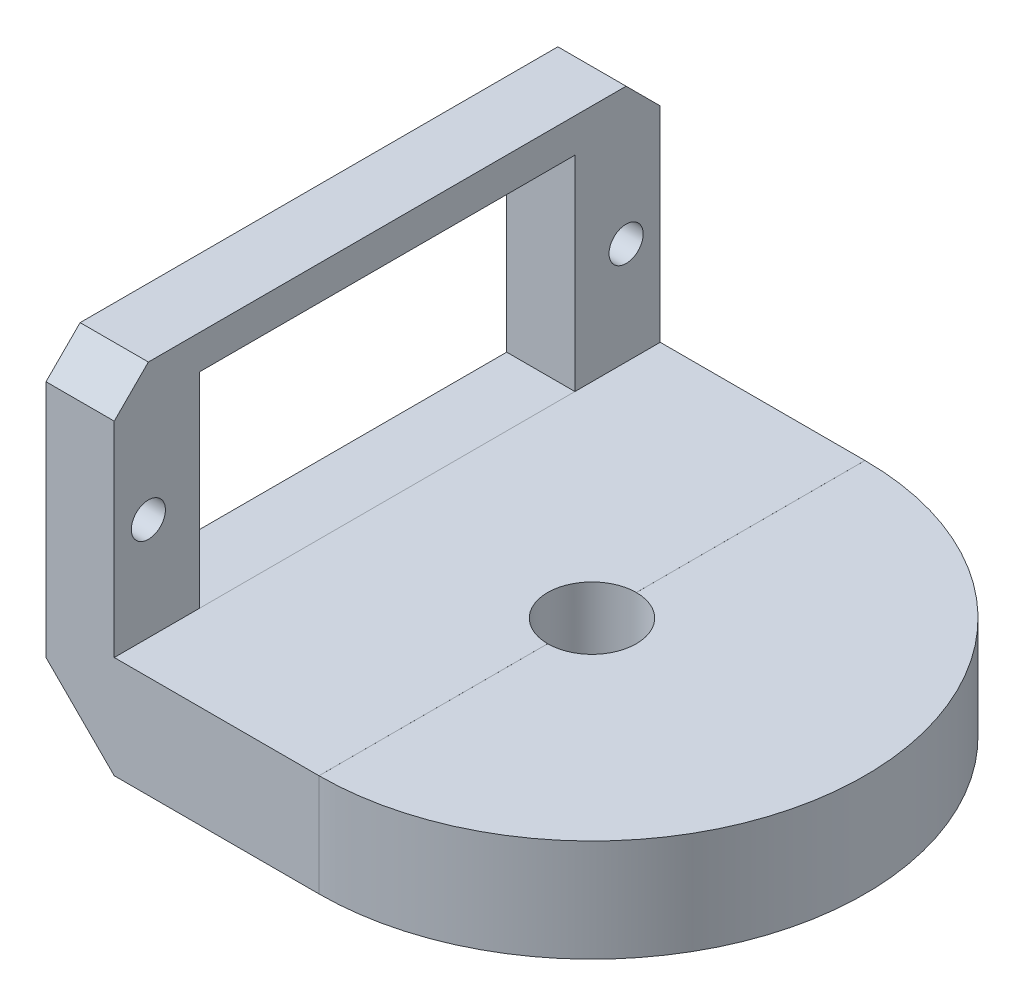
ISO-10303-21;
HEADER;
FILE_DESCRIPTION(('STEP AP214'),'2;1');
FILE_NAME('part.step','',(''),(''),'','','');
FILE_SCHEMA(('AUTOMOTIVE_DESIGN { 1 0 10303 214 1 1 1 1 }'));
ENDSEC;
DATA;
#1=APPLICATION_CONTEXT('core data for automotive mechanical design processes');
#2=APPLICATION_PROTOCOL_DEFINITION('international standard','automotive_design',2000,#1);
#3=PRODUCT_CONTEXT('',#1,'mechanical');
#4=PRODUCT('Part','Part','',(#3));
#5=PRODUCT_RELATED_PRODUCT_CATEGORY('part','',(#4));
#6=PRODUCT_DEFINITION_FORMATION('','',#4);
#7=PRODUCT_DEFINITION_CONTEXT('part definition',#1,'design');
#8=PRODUCT_DEFINITION('design','',#6,#7);
#9=PRODUCT_DEFINITION_SHAPE('','',#8);
#10=(LENGTH_UNIT() NAMED_UNIT(*) SI_UNIT(.MILLI.,.METRE.));
#11=(NAMED_UNIT(*) PLANE_ANGLE_UNIT() SI_UNIT($,.RADIAN.));
#12=(NAMED_UNIT(*) SI_UNIT($,.STERADIAN.) SOLID_ANGLE_UNIT());
#13=UNCERTAINTY_MEASURE_WITH_UNIT(LENGTH_MEASURE(1.E-05),#10,'distance_accuracy_value','');
#14=(GEOMETRIC_REPRESENTATION_CONTEXT(3) GLOBAL_UNCERTAINTY_ASSIGNED_CONTEXT((#13)) GLOBAL_UNIT_ASSIGNED_CONTEXT((#10,
#11,#12)) REPRESENTATION_CONTEXT('',''));
#15=CARTESIAN_POINT('',(0.,0.,0.));
#16=DIRECTION('',(0.,0.,1.));
#17=DIRECTION('',(1.,0.,0.));
#18=AXIS2_PLACEMENT_3D('',#15,#16,#17);
#19=CARTESIAN_POINT('',(16.,0.,0.));
#20=DIRECTION('',(1.,0.,0.));
#21=DIRECTION('',(0.,0.,-1.));
#22=AXIS2_PLACEMENT_3D('',#19,#20,#21);
#23=PLANE('',#22);
#24=DIRECTION('',(0.,-1.,0.));
#25=VECTOR('',#24,1.);
#26=CARTESIAN_POINT('',(16.,16.,-13.4));
#27=LINE('',#26,#25);
#28=CARTESIAN_POINT('',(16.,2.00126094570929,-13.4));
#29=VERTEX_POINT('',#28);
#30=CARTESIAN_POINT('',(16.,2.,-13.4));
#31=VERTEX_POINT('',#30);
#32=EDGE_CURVE('E172',#29,#31,#27,.T.);
#33=ORIENTED_EDGE('',*,*,#32,.F.);
#34=DIRECTION('',(0.,0.,1.));
#35=VECTOR('',#34,1.);
#36=CARTESIAN_POINT('',(16.,2.00126094570929,-32.));
#37=LINE('',#36,#35);
#38=CARTESIAN_POINT('',(16.,2.00126094570929,0.));
#39=VERTEX_POINT('',#38);
#40=EDGE_CURVE('E205',#29,#39,#37,.T.);
#41=ORIENTED_EDGE('',*,*,#40,.T.);
#42=DIRECTION('',(0.,-1.,0.));
#43=VECTOR('',#42,1.);
#44=CARTESIAN_POINT('',(16.,0.,0.));
#45=LINE('',#44,#43);
#46=CARTESIAN_POINT('',(16.,2.,0.));
#47=VERTEX_POINT('',#46);
#48=EDGE_CURVE('E209',#39,#47,#45,.T.);
#49=ORIENTED_EDGE('',*,*,#48,.T.);
#50=DIRECTION('',(0.,0.,-1.));
#51=VECTOR('',#50,1.);
#52=CARTESIAN_POINT('',(16.,2.,0.));
#53=LINE('',#52,#51);
#54=EDGE_CURVE('E193',#47,#31,#53,.T.);
#55=ORIENTED_EDGE('',*,*,#54,.T.);
#56=EDGE_LOOP('',(#33,#41,#49,#55));
#57=FACE_BOUND('',#56,.T.);
#58=ADVANCED_FACE('F44',(#57),#23,.T.);
#59=DIRECTION('',(0.,-1.,0.));
#60=VECTOR('',#59,1.);
#61=CARTESIAN_POINT('',(16.,16.,-18.6));
#62=LINE('',#61,#60);
#63=CARTESIAN_POINT('',(16.,2.,-18.6));
#64=VERTEX_POINT('',#63);
#65=CARTESIAN_POINT('',(16.,2.00126094570929,-18.6));
#66=VERTEX_POINT('',#65);
#67=EDGE_CURVE('E169',#64,#66,#62,.F.);
#68=ORIENTED_EDGE('',*,*,#67,.F.);
#69=CARTESIAN_POINT('',(16.,2.,-32.));
#70=VERTEX_POINT('',#69);
#71=EDGE_CURVE('E182',#64,#70,#53,.T.);
#72=ORIENTED_EDGE('',*,*,#71,.T.);
#73=DIRECTION('',(0.,1.,0.));
#74=VECTOR('',#73,1.);
#75=CARTESIAN_POINT('',(16.,0.,-32.));
#76=LINE('',#75,#74);
#77=CARTESIAN_POINT('',(16.,2.00126094570929,-32.));
#78=VERTEX_POINT('',#77);
#79=EDGE_CURVE('E206',#70,#78,#76,.T.);
#80=ORIENTED_EDGE('',*,*,#79,.T.);
#81=EDGE_CURVE('E185',#78,#66,#37,.T.);
#82=ORIENTED_EDGE('',*,*,#81,.T.);
#83=EDGE_LOOP('',(#68,#72,#80,#82));
#84=FACE_BOUND('',#83,.T.);
#85=ADVANCED_FACE('F181',(#84),#23,.T.);
#86=CARTESIAN_POINT('',(4.,0.,0.));
#87=DIRECTION('',(-1.,0.,0.));
#88=DIRECTION('',(0.,0.,1.));
#89=AXIS2_PLACEMENT_3D('',#86,#87,#88);
#90=PLANE('',#89);
#91=CARTESIAN_POINT('',(4.,8.,-30.));
#92=DIRECTION('',(-1.,0.,0.));
#93=DIRECTION('',(0.,0.,1.));
#94=AXIS2_PLACEMENT_3D('',#91,#92,#93);
#95=CIRCLE('',#94,1.);
#96=CARTESIAN_POINT('',(4.,8.,-29.));
#97=VERTEX_POINT('',#96);
#98=EDGE_CURVE('E378',#97,#97,#95,.T.);
#99=ORIENTED_EDGE('',*,*,#98,.T.);
#100=EDGE_LOOP('',(#99));
#101=FACE_BOUND('',#100,.T.);
#102=CARTESIAN_POINT('',(4.,8.00000000000001,-2.));
#103=DIRECTION('',(-1.,0.,0.));
#104=DIRECTION('',(0.,0.,1.));
#105=AXIS2_PLACEMENT_3D('',#102,#103,#104);
#106=CIRCLE('',#105,1.);
#107=CARTESIAN_POINT('',(4.,8.00000000000001,-0.999999999999999));
#108=VERTEX_POINT('',#107);
#109=EDGE_CURVE('E382',#108,#108,#106,.T.);
#110=ORIENTED_EDGE('',*,*,#109,.T.);
#111=EDGE_LOOP('',(#110));
#112=FACE_BOUND('',#111,.T.);
#113=DIRECTION('',(0.,0.,1.));
#114=VECTOR('',#113,1.);
#115=CARTESIAN_POINT('',(4.,16.,0.));
#116=LINE('',#115,#114);
#117=CARTESIAN_POINT('',(4.,16.,-30.));
#118=VERTEX_POINT('',#117);
#119=CARTESIAN_POINT('',(4.,16.,-2.00000000000002));
#120=VERTEX_POINT('',#119);
#121=EDGE_CURVE('E280',#118,#120,#116,.T.);
#122=ORIENTED_EDGE('',*,*,#121,.T.);
#123=DIRECTION('',(0.,0.707106781186546,-0.707106781186549));
#124=VECTOR('',#123,1.);
#125=CARTESIAN_POINT('',(4.,14.,0.));
#126=LINE('',#125,#124);
#127=CARTESIAN_POINT('',(4.,14.,0.));
#128=VERTEX_POINT('',#127);
#129=EDGE_CURVE('E54',#120,#128,#126,.F.);
#130=ORIENTED_EDGE('',*,*,#129,.T.);
#131=DIRECTION('',(0.,-1.,0.));
#132=VECTOR('',#131,1.);
#133=CARTESIAN_POINT('',(4.,0.,0.));
#134=LINE('',#133,#132);
#135=CARTESIAN_POINT('',(4.,2.00126094570929,0.));
#136=VERTEX_POINT('',#135);
#137=EDGE_CURVE('E273',#128,#136,#134,.T.);
#138=ORIENTED_EDGE('',*,*,#137,.T.);
#139=DIRECTION('',(0.,0.,1.));
#140=VECTOR('',#139,1.);
#141=CARTESIAN_POINT('',(4.,2.00126094570929,-32.));
#142=LINE('',#141,#140);
#143=CARTESIAN_POINT('',(4.,2.00126094570929,-5.));
#144=VERTEX_POINT('',#143);
#145=EDGE_CURVE('E218',#144,#136,#142,.T.);
#146=ORIENTED_EDGE('',*,*,#145,.F.);
#147=DIRECTION('',(0.,-1.,0.));
#148=VECTOR('',#147,1.);
#149=CARTESIAN_POINT('',(4.,2.,-5.));
#150=LINE('',#149,#148);
#151=CARTESIAN_POINT('',(4.,14.,-5.));
#152=VERTEX_POINT('',#151);
#153=EDGE_CURVE('E227',#152,#144,#150,.T.);
#154=ORIENTED_EDGE('',*,*,#153,.F.);
#155=DIRECTION('',(0.,0.,1.));
#156=VECTOR('',#155,1.);
#157=CARTESIAN_POINT('',(4.,14.,-5.));
#158=LINE('',#157,#156);
#159=CARTESIAN_POINT('',(4.,14.,-27.));
#160=VERTEX_POINT('',#159);
#161=EDGE_CURVE('E240',#160,#152,#158,.T.);
#162=ORIENTED_EDGE('',*,*,#161,.F.);
#163=DIRECTION('',(0.,1.,0.));
#164=VECTOR('',#163,1.);
#165=CARTESIAN_POINT('',(4.,2.,-27.));
#166=LINE('',#165,#164);
#167=CARTESIAN_POINT('',(4.,2.00126094570929,-27.));
#168=VERTEX_POINT('',#167);
#169=EDGE_CURVE('E235',#168,#160,#166,.T.);
#170=ORIENTED_EDGE('',*,*,#169,.F.);
#171=CARTESIAN_POINT('',(4.,2.00126094570929,-32.));
#172=VERTEX_POINT('',#171);
#173=EDGE_CURVE('E214',#172,#168,#142,.T.);
#174=ORIENTED_EDGE('',*,*,#173,.F.);
#175=DIRECTION('',(0.,1.,0.));
#176=VECTOR('',#175,1.);
#177=CARTESIAN_POINT('',(4.,0.,-32.));
#178=LINE('',#177,#176);
#179=CARTESIAN_POINT('',(4.,14.,-32.));
#180=VERTEX_POINT('',#179);
#181=EDGE_CURVE('E276',#172,#180,#178,.T.);
#182=ORIENTED_EDGE('',*,*,#181,.T.);
#183=DIRECTION('',(0.,-0.707106781186549,-0.707106781186546));
#184=VECTOR('',#183,1.);
#185=CARTESIAN_POINT('',(4.,16.,-30.));
#186=LINE('',#185,#184);
#187=EDGE_CURVE('E320',#180,#118,#186,.F.);
#188=ORIENTED_EDGE('',*,*,#187,.T.);
#189=EDGE_LOOP('',(#122,#130,#138,#146,#154,#162,#170,#174,#182,#188));
#190=FACE_BOUND('',#189,.T.);
#191=ADVANCED_FACE('F326',(#101,#112,#190),#90,.F.);
#192=CARTESIAN_POINT('',(0.,0.,0.));
#193=DIRECTION('',(-1.,0.,0.));
#194=DIRECTION('',(0.,0.,1.));
#195=AXIS2_PLACEMENT_3D('',#192,#193,#194);
#196=PLANE('',#195);
#197=CARTESIAN_POINT('',(0.,8.,-30.));
#198=DIRECTION('',(-1.,0.,0.));
#199=DIRECTION('',(0.,0.,1.));
#200=AXIS2_PLACEMENT_3D('',#197,#198,#199);
#201=CIRCLE('',#200,1.);
#202=CARTESIAN_POINT('',(0.,8.,-29.));
#203=VERTEX_POINT('',#202);
#204=EDGE_CURVE('E386',#203,#203,#201,.T.);
#205=ORIENTED_EDGE('',*,*,#204,.F.);
#206=EDGE_LOOP('',(#205));
#207=FACE_BOUND('',#206,.T.);
#208=CARTESIAN_POINT('',(0.,8.00000000000001,-2.));
#209=DIRECTION('',(-1.,0.,0.));
#210=DIRECTION('',(0.,0.,1.));
#211=AXIS2_PLACEMENT_3D('',#208,#209,#210);
#212=CIRCLE('',#211,1.);
#213=CARTESIAN_POINT('',(0.,8.00000000000001,-0.999999999999999));
#214=VERTEX_POINT('',#213);
#215=EDGE_CURVE('E387',#214,#214,#212,.T.);
#216=ORIENTED_EDGE('',*,*,#215,.F.);
#217=EDGE_LOOP('',(#216));
#218=FACE_BOUND('',#217,.T.);
#219=DIRECTION('',(0.,0.,-1.));
#220=VECTOR('',#219,1.);
#221=CARTESIAN_POINT('',(0.,2.,-5.));
#222=LINE('',#221,#220);
#223=CARTESIAN_POINT('',(0.,2.,-5.));
#224=VERTEX_POINT('',#223);
#225=CARTESIAN_POINT('',(0.,2.,-27.));
#226=VERTEX_POINT('',#225);
#227=EDGE_CURVE('E247',#224,#226,#222,.T.);
#228=ORIENTED_EDGE('',*,*,#227,.T.);
#229=DIRECTION('',(0.,1.,0.));
#230=VECTOR('',#229,1.);
#231=CARTESIAN_POINT('',(0.,2.,-27.));
#232=LINE('',#231,#230);
#233=CARTESIAN_POINT('',(0.,14.,-27.));
#234=VERTEX_POINT('',#233);
#235=EDGE_CURVE('E251',#226,#234,#232,.T.);
#236=ORIENTED_EDGE('',*,*,#235,.T.);
#237=DIRECTION('',(0.,0.,1.));
#238=VECTOR('',#237,1.);
#239=CARTESIAN_POINT('',(0.,14.,-5.));
#240=LINE('',#239,#238);
#241=CARTESIAN_POINT('',(0.,14.,-5.));
#242=VERTEX_POINT('',#241);
#243=EDGE_CURVE('E255',#234,#242,#240,.T.);
#244=ORIENTED_EDGE('',*,*,#243,.T.);
#245=DIRECTION('',(0.,-1.,0.));
#246=VECTOR('',#245,1.);
#247=CARTESIAN_POINT('',(0.,2.,-5.));
#248=LINE('',#247,#246);
#249=EDGE_CURVE('E226',#242,#224,#248,.T.);
#250=ORIENTED_EDGE('',*,*,#249,.T.);
#251=EDGE_LOOP('',(#228,#236,#244,#250));
#252=FACE_BOUND('',#251,.T.);
#253=DIRECTION('',(0.,-1.,0.));
#254=VECTOR('',#253,1.);
#255=CARTESIAN_POINT('',(0.,0.,0.));
#256=LINE('',#255,#254);
#257=CARTESIAN_POINT('',(0.,14.,0.));
#258=VERTEX_POINT('',#257);
#259=CARTESIAN_POINT('',(0.,0.,0.));
#260=VERTEX_POINT('',#259);
#261=EDGE_CURVE('E272',#258,#260,#256,.T.);
#262=ORIENTED_EDGE('',*,*,#261,.F.);
#263=DIRECTION('',(0.,-0.707106781186546,0.707106781186549));
#264=VECTOR('',#263,1.);
#265=CARTESIAN_POINT('',(0.,7.00000000000002,6.99999999999999));
#266=LINE('',#265,#264);
#267=CARTESIAN_POINT('',(0.,16.,-2.00000000000002));
#268=VERTEX_POINT('',#267);
#269=EDGE_CURVE('E311',#258,#268,#266,.F.);
#270=ORIENTED_EDGE('',*,*,#269,.T.);
#271=DIRECTION('',(0.,0.,1.));
#272=VECTOR('',#271,1.);
#273=CARTESIAN_POINT('',(0.,16.,0.));
#274=LINE('',#273,#272);
#275=CARTESIAN_POINT('',(0.,16.,-30.));
#276=VERTEX_POINT('',#275);
#277=EDGE_CURVE('E277',#276,#268,#274,.T.);
#278=ORIENTED_EDGE('',*,*,#277,.F.);
#279=DIRECTION('',(0.,0.707106781186549,0.707106781186546));
#280=VECTOR('',#279,1.);
#281=CARTESIAN_POINT('',(0.,23.,-23.));
#282=LINE('',#281,#280);
#283=CARTESIAN_POINT('',(0.,14.,-32.));
#284=VERTEX_POINT('',#283);
#285=EDGE_CURVE('E308',#276,#284,#282,.F.);
#286=ORIENTED_EDGE('',*,*,#285,.T.);
#287=DIRECTION('',(0.,1.,0.));
#288=VECTOR('',#287,1.);
#289=CARTESIAN_POINT('',(0.,0.,-32.));
#290=LINE('',#289,#288);
#291=CARTESIAN_POINT('',(0.,0.,-32.));
#292=VERTEX_POINT('',#291);
#293=EDGE_CURVE('E285',#292,#284,#290,.T.);
#294=ORIENTED_EDGE('',*,*,#293,.F.);
#295=DIRECTION('',(0.,0.,1.));
#296=VECTOR('',#295,1.);
#297=CARTESIAN_POINT('',(0.,0.,0.));
#298=LINE('',#297,#296);
#299=EDGE_CURVE('E297',#292,#260,#298,.T.);
#300=ORIENTED_EDGE('',*,*,#299,.T.);
#301=EDGE_LOOP('',(#262,#270,#278,#286,#294,#300));
#302=FACE_BOUND('',#301,.T.);
#303=ADVANCED_FACE('F338',(#207,#218,#252,#302),#196,.T.);
#304=CARTESIAN_POINT('',(4.,0.,0.));
#305=DIRECTION('',(0.,0.,-1.));
#306=DIRECTION('',(-1.,0.,0.));
#307=AXIS2_PLACEMENT_3D('',#304,#305,#306);
#308=PLANE('',#307);
#309=ORIENTED_EDGE('',*,*,#137,.F.);
#310=DIRECTION('',(-1.,0.,0.));
#311=VECTOR('',#310,1.);
#312=CARTESIAN_POINT('',(4.,14.,0.));
#313=LINE('',#312,#311);
#314=EDGE_CURVE('E304',#128,#258,#313,.T.);
#315=ORIENTED_EDGE('',*,*,#314,.T.);
#316=ORIENTED_EDGE('',*,*,#261,.T.);
#317=DIRECTION('',(-0.707106781186546,0.707106781186549,0.));
#318=VECTOR('',#317,1.);
#319=CARTESIAN_POINT('',(4.,-4.,0.));
#320=LINE('',#319,#318);
#321=CARTESIAN_POINT('',(4.,-4.,0.));
#322=VERTEX_POINT('',#321);
#323=EDGE_CURVE('E301',#260,#322,#320,.F.);
#324=ORIENTED_EDGE('',*,*,#323,.T.);
#325=DIRECTION('',(-1.,0.,0.));
#326=VECTOR('',#325,1.);
#327=CARTESIAN_POINT('',(0.,-4.,0.));
#328=LINE('',#327,#326);
#329=CARTESIAN_POINT('',(16.,-4.,0.));
#330=VERTEX_POINT('',#329);
#331=EDGE_CURVE('E358',#330,#322,#328,.T.);
#332=ORIENTED_EDGE('',*,*,#331,.F.);
#333=DIRECTION('',(0.,-1.,0.));
#334=VECTOR('',#333,1.);
#335=CARTESIAN_POINT('',(16.,2.,0.));
#336=LINE('',#335,#334);
#337=EDGE_CURVE('E194',#47,#330,#336,.T.);
#338=ORIENTED_EDGE('',*,*,#337,.F.);
#339=ORIENTED_EDGE('',*,*,#48,.F.);
#340=DIRECTION('',(-1.,0.,0.));
#341=VECTOR('',#340,1.);
#342=CARTESIAN_POINT('',(16.,2.00126094570929,0.));
#343=LINE('',#342,#341);
#344=EDGE_CURVE('E213',#39,#136,#343,.T.);
#345=ORIENTED_EDGE('',*,*,#344,.T.);
#346=EDGE_LOOP('',(#309,#315,#316,#324,#332,#338,#339,#345));
#347=FACE_BOUND('',#346,.T.);
#348=ADVANCED_FACE('F331',(#347),#308,.F.);
#349=CARTESIAN_POINT('',(4.,0.,-32.));
#350=DIRECTION('',(0.,0.,1.));
#351=DIRECTION('',(1.,0.,0.));
#352=AXIS2_PLACEMENT_3D('',#349,#350,#351);
#353=PLANE('',#352);
#354=ORIENTED_EDGE('',*,*,#293,.T.);
#355=DIRECTION('',(1.,0.,0.));
#356=VECTOR('',#355,1.);
#357=CARTESIAN_POINT('',(4.,14.,-32.));
#358=LINE('',#357,#356);
#359=EDGE_CURVE('E11',#284,#180,#358,.T.);
#360=ORIENTED_EDGE('',*,*,#359,.T.);
#361=ORIENTED_EDGE('',*,*,#181,.F.);
#362=DIRECTION('',(-1.,0.,0.));
#363=VECTOR('',#362,1.);
#364=CARTESIAN_POINT('',(16.,2.00126094570929,-32.));
#365=LINE('',#364,#363);
#366=EDGE_CURVE('E222',#78,#172,#365,.T.);
#367=ORIENTED_EDGE('',*,*,#366,.F.);
#368=ORIENTED_EDGE('',*,*,#79,.F.);
#369=CARTESIAN_POINT('',(16.,-4.,-32.));
#370=VERTEX_POINT('',#369);
#371=EDGE_CURVE('E202',#370,#70,#76,.T.);
#372=ORIENTED_EDGE('',*,*,#371,.F.);
#373=DIRECTION('',(1.,0.,0.));
#374=VECTOR('',#373,1.);
#375=CARTESIAN_POINT('',(0.,-4.,-32.));
#376=LINE('',#375,#374);
#377=CARTESIAN_POINT('',(4.,-4.,-32.));
#378=VERTEX_POINT('',#377);
#379=EDGE_CURVE('E348',#378,#370,#376,.T.);
#380=ORIENTED_EDGE('',*,*,#379,.F.);
#381=DIRECTION('',(0.707106781186546,-0.707106781186549,0.));
#382=VECTOR('',#381,1.);
#383=CARTESIAN_POINT('',(4.,-4.,-32.));
#384=LINE('',#383,#382);
#385=EDGE_CURVE('E294',#378,#292,#384,.F.);
#386=ORIENTED_EDGE('',*,*,#385,.T.);
#387=EDGE_LOOP('',(#354,#360,#361,#367,#368,#372,#380,#386));
#388=FACE_BOUND('',#387,.T.);
#389=ADVANCED_FACE('F345',(#388),#353,.F.);
#390=CARTESIAN_POINT('',(4.,16.,0.));
#391=DIRECTION('',(0.,-1.,0.));
#392=DIRECTION('',(0.,0.,-1.));
#393=AXIS2_PLACEMENT_3D('',#390,#391,#392);
#394=PLANE('',#393);
#395=ORIENTED_EDGE('',*,*,#277,.T.);
#396=DIRECTION('',(1.,0.,0.));
#397=VECTOR('',#396,1.);
#398=CARTESIAN_POINT('',(4.,16.,-2.00000000000002));
#399=LINE('',#398,#397);
#400=EDGE_CURVE('E67',#268,#120,#399,.T.);
#401=ORIENTED_EDGE('',*,*,#400,.T.);
#402=ORIENTED_EDGE('',*,*,#121,.F.);
#403=DIRECTION('',(-1.,0.,0.));
#404=VECTOR('',#403,1.);
#405=CARTESIAN_POINT('',(4.,16.,-30.));
#406=LINE('',#405,#404);
#407=EDGE_CURVE('E314',#118,#276,#406,.T.);
#408=ORIENTED_EDGE('',*,*,#407,.T.);
#409=EDGE_LOOP('',(#395,#401,#402,#408));
#410=FACE_BOUND('',#409,.T.);
#411=ADVANCED_FACE('F339',(#410),#394,.F.);
#412=CARTESIAN_POINT('',(4.,2.,-5.));
#413=DIRECTION('',(0.,0.,-1.));
#414=DIRECTION('',(-1.,0.,0.));
#415=AXIS2_PLACEMENT_3D('',#412,#413,#414);
#416=PLANE('',#415);
#417=ORIENTED_EDGE('',*,*,#249,.F.);
#418=DIRECTION('',(-1.,0.,0.));
#419=VECTOR('',#418,1.);
#420=CARTESIAN_POINT('',(4.,14.,-5.));
#421=LINE('',#420,#419);
#422=EDGE_CURVE('E243',#152,#242,#421,.T.);
#423=ORIENTED_EDGE('',*,*,#422,.F.);
#424=ORIENTED_EDGE('',*,*,#153,.T.);
#425=CARTESIAN_POINT('',(4.,2.,-5.));
#426=VERTEX_POINT('',#425);
#427=EDGE_CURVE('E232',#144,#426,#150,.T.);
#428=ORIENTED_EDGE('',*,*,#427,.T.);
#429=DIRECTION('',(-1.,0.,0.));
#430=VECTOR('',#429,1.);
#431=CARTESIAN_POINT('',(4.,2.,-5.));
#432=LINE('',#431,#430);
#433=EDGE_CURVE('E268',#426,#224,#432,.T.);
#434=ORIENTED_EDGE('',*,*,#433,.T.);
#435=EDGE_LOOP('',(#417,#423,#424,#428,#434));
#436=FACE_BOUND('',#435,.T.);
#437=ADVANCED_FACE('F410',(#436),#416,.T.);
#438=CARTESIAN_POINT('',(4.,2.,-5.));
#439=DIRECTION('',(0.,1.,0.));
#440=DIRECTION('',(0.,0.,1.));
#441=AXIS2_PLACEMENT_3D('',#438,#439,#440);
#442=PLANE('',#441);
#443=ORIENTED_EDGE('',*,*,#227,.F.);
#444=ORIENTED_EDGE('',*,*,#433,.F.);
#445=DIRECTION('',(0.,0.,-1.));
#446=VECTOR('',#445,1.);
#447=CARTESIAN_POINT('',(4.,2.,-5.));
#448=LINE('',#447,#446);
#449=CARTESIAN_POINT('',(4.,2.,-27.));
#450=VERTEX_POINT('',#449);
#451=EDGE_CURVE('E231',#426,#450,#448,.T.);
#452=ORIENTED_EDGE('',*,*,#451,.T.);
#453=DIRECTION('',(-1.,0.,0.));
#454=VECTOR('',#453,1.);
#455=CARTESIAN_POINT('',(4.,2.,-27.));
#456=LINE('',#455,#454);
#457=EDGE_CURVE('E265',#450,#226,#456,.T.);
#458=ORIENTED_EDGE('',*,*,#457,.T.);
#459=EDGE_LOOP('',(#443,#444,#452,#458));
#460=FACE_BOUND('',#459,.T.);
#461=ADVANCED_FACE('F406',(#460),#442,.T.);
#462=CARTESIAN_POINT('',(4.,2.,-27.));
#463=DIRECTION('',(0.,0.,1.));
#464=DIRECTION('',(1.,0.,0.));
#465=AXIS2_PLACEMENT_3D('',#462,#463,#464);
#466=PLANE('',#465);
#467=ORIENTED_EDGE('',*,*,#235,.F.);
#468=ORIENTED_EDGE('',*,*,#457,.F.);
#469=EDGE_CURVE('E236',#450,#168,#166,.T.);
#470=ORIENTED_EDGE('',*,*,#469,.T.);
#471=ORIENTED_EDGE('',*,*,#169,.T.);
#472=DIRECTION('',(-1.,0.,0.));
#473=VECTOR('',#472,1.);
#474=CARTESIAN_POINT('',(4.,14.,-27.));
#475=LINE('',#474,#473);
#476=EDGE_CURVE('E262',#160,#234,#475,.T.);
#477=ORIENTED_EDGE('',*,*,#476,.T.);
#478=EDGE_LOOP('',(#467,#468,#470,#471,#477));
#479=FACE_BOUND('',#478,.T.);
#480=ADVANCED_FACE('F431',(#479),#466,.T.);
#481=CARTESIAN_POINT('',(4.,14.,-5.));
#482=DIRECTION('',(0.,-1.,0.));
#483=DIRECTION('',(0.,0.,-1.));
#484=AXIS2_PLACEMENT_3D('',#481,#482,#483);
#485=PLANE('',#484);
#486=ORIENTED_EDGE('',*,*,#243,.F.);
#487=ORIENTED_EDGE('',*,*,#476,.F.);
#488=ORIENTED_EDGE('',*,*,#161,.T.);
#489=ORIENTED_EDGE('',*,*,#422,.T.);
#490=EDGE_LOOP('',(#486,#487,#488,#489));
#491=FACE_BOUND('',#490,.T.);
#492=ADVANCED_FACE('F429',(#491),#485,.T.);
#493=CARTESIAN_POINT('',(16.,2.00126094570929,-32.));
#494=DIRECTION('',(0.,-1.,0.));
#495=DIRECTION('',(0.,0.,-1.));
#496=AXIS2_PLACEMENT_3D('',#493,#494,#495);
#497=PLANE('',#496);
#498=ORIENTED_EDGE('',*,*,#40,.F.);
#499=CARTESIAN_POINT('',(16.,2.00126094570929,-16.));
#500=DIRECTION('',(0.,-1.,0.));
#501=DIRECTION('',(0.,0.,-1.));
#502=AXIS2_PLACEMENT_3D('',#499,#500,#501);
#503=CIRCLE('',#502,2.6);
#504=EDGE_CURVE('E370',#29,#66,#503,.T.);
#505=ORIENTED_EDGE('',*,*,#504,.T.);
#506=ORIENTED_EDGE('',*,*,#81,.F.);
#507=ORIENTED_EDGE('',*,*,#366,.T.);
#508=ORIENTED_EDGE('',*,*,#173,.T.);
#509=EDGE_CURVE('E198',#168,#144,#142,.T.);
#510=ORIENTED_EDGE('',*,*,#509,.T.);
#511=ORIENTED_EDGE('',*,*,#145,.T.);
#512=ORIENTED_EDGE('',*,*,#344,.F.);
#513=EDGE_LOOP('',(#498,#505,#506,#507,#508,#510,#511,#512));
#514=FACE_BOUND('',#513,.T.);
#515=ADVANCED_FACE('F424',(#514),#497,.F.);
#516=CARTESIAN_POINT('',(4.,0.,0.));
#517=DIRECTION('',(1.,0.,0.));
#518=DIRECTION('',(0.,0.,-1.));
#519=AXIS2_PLACEMENT_3D('',#516,#517,#518);
#520=PLANE('',#519);
#521=ORIENTED_EDGE('',*,*,#427,.F.);
#522=ORIENTED_EDGE('',*,*,#509,.F.);
#523=ORIENTED_EDGE('',*,*,#469,.F.);
#524=ORIENTED_EDGE('',*,*,#451,.F.);
#525=EDGE_LOOP('',(#521,#522,#523,#524));
#526=FACE_BOUND('',#525,.T.);
#527=ADVANCED_FACE('F434',(#526),#520,.F.);
#528=CARTESIAN_POINT('',(16.,2.,-16.));
#529=DIRECTION('',(0.,-1.,0.));
#530=DIRECTION('',(0.,0.,-1.));
#531=AXIS2_PLACEMENT_3D('',#528,#529,#530);
#532=PLANE('',#531);
#533=ORIENTED_EDGE('',*,*,#71,.F.);
#534=CARTESIAN_POINT('',(16.,2.,-16.));
#535=DIRECTION('',(0.,-1.,0.));
#536=DIRECTION('',(0.,0.,-1.));
#537=AXIS2_PLACEMENT_3D('',#534,#535,#536);
#538=CIRCLE('',#537,2.6);
#539=EDGE_CURVE('E166',#64,#31,#538,.T.);
#540=ORIENTED_EDGE('',*,*,#539,.T.);
#541=ORIENTED_EDGE('',*,*,#54,.F.);
#542=CARTESIAN_POINT('',(16.,2.,-16.));
#543=DIRECTION('',(0.,-1.,0.));
#544=DIRECTION('',(0.,0.,-1.));
#545=AXIS2_PLACEMENT_3D('',#542,#543,#544);
#546=CIRCLE('',#545,16.);
#547=EDGE_CURVE('E190',#70,#47,#546,.T.);
#548=ORIENTED_EDGE('',*,*,#547,.F.);
#549=EDGE_LOOP('',(#533,#540,#541,#548));
#550=FACE_BOUND('',#549,.T.);
#551=ADVANCED_FACE('F188',(#550),#532,.F.);
#552=CARTESIAN_POINT('',(16.,2.,-16.));
#553=DIRECTION('',(0.,-1.,0.));
#554=DIRECTION('',(0.,0.,-1.));
#555=AXIS2_PLACEMENT_3D('',#552,#553,#554);
#556=CYLINDRICAL_SURFACE('',#555,16.);
#557=ORIENTED_EDGE('',*,*,#337,.T.);
#558=CARTESIAN_POINT('',(16.,-4.,-16.));
#559=DIRECTION('',(0.,-1.,0.));
#560=DIRECTION('',(0.,0.,-1.));
#561=AXIS2_PLACEMENT_3D('',#558,#559,#560);
#562=CIRCLE('',#561,16.);
#563=EDGE_CURVE('E360',#370,#330,#562,.T.);
#564=ORIENTED_EDGE('',*,*,#563,.F.);
#565=ORIENTED_EDGE('',*,*,#371,.T.);
#566=ORIENTED_EDGE('',*,*,#547,.T.);
#567=EDGE_LOOP('',(#557,#564,#565,#566));
#568=FACE_BOUND('',#567,.T.);
#569=ADVANCED_FACE('F439',(#568),#556,.T.);
#570=CARTESIAN_POINT('',(16.,-4.,-16.));
#571=DIRECTION('',(0.,-1.,0.));
#572=DIRECTION('',(0.,0.,-1.));
#573=AXIS2_PLACEMENT_3D('',#570,#571,#572);
#574=PLANE('',#573);
#575=CARTESIAN_POINT('',(16.,-4.,-16.));
#576=DIRECTION('',(0.,-1.,0.));
#577=DIRECTION('',(0.,0.,-1.));
#578=AXIS2_PLACEMENT_3D('',#575,#576,#577);
#579=CIRCLE('',#578,2.6);
#580=CARTESIAN_POINT('',(16.,-4.,-18.6));
#581=VERTEX_POINT('',#580);
#582=EDGE_CURVE('E177',#581,#581,#579,.T.);
#583=ORIENTED_EDGE('',*,*,#582,.F.);
#584=EDGE_LOOP('',(#583));
#585=FACE_BOUND('',#584,.T.);
#586=ORIENTED_EDGE('',*,*,#331,.T.);
#587=DIRECTION('',(0.,0.,-1.));
#588=VECTOR('',#587,1.);
#589=CARTESIAN_POINT('',(4.,-4.,-16.));
#590=LINE('',#589,#588);
#591=EDGE_CURVE('E290',#322,#378,#590,.T.);
#592=ORIENTED_EDGE('',*,*,#591,.T.);
#593=ORIENTED_EDGE('',*,*,#379,.T.);
#594=ORIENTED_EDGE('',*,*,#563,.T.);
#595=EDGE_LOOP('',(#586,#592,#593,#594));
#596=FACE_BOUND('',#595,.T.);
#597=ADVANCED_FACE('F355',(#585,#596),#574,.T.);
#598=CARTESIAN_POINT('',(4.,-4.,-16.));
#599=DIRECTION('',(0.707106781186549,0.707106781186546,0.));
#600=DIRECTION('',(0.,0.,-1.));
#601=AXIS2_PLACEMENT_3D('',#598,#599,#600);
#602=PLANE('',#601);
#603=ORIENTED_EDGE('',*,*,#323,.F.);
#604=ORIENTED_EDGE('',*,*,#299,.F.);
#605=ORIENTED_EDGE('',*,*,#385,.F.);
#606=ORIENTED_EDGE('',*,*,#591,.F.);
#607=EDGE_LOOP('',(#603,#604,#605,#606));
#608=FACE_BOUND('',#607,.T.);
#609=ADVANCED_FACE('F352',(#608),#602,.F.);
#610=CARTESIAN_POINT('',(16.,16.,-16.));
#611=DIRECTION('',(0.,-1.,0.));
#612=DIRECTION('',(0.,0.,-1.));
#613=AXIS2_PLACEMENT_3D('',#610,#611,#612);
#614=CYLINDRICAL_SURFACE('',#613,2.6);
#615=ORIENTED_EDGE('',*,*,#582,.T.);
#616=EDGE_LOOP('',(#615));
#617=FACE_BOUND('',#616,.T.);
#618=ORIENTED_EDGE('',*,*,#32,.T.);
#619=ORIENTED_EDGE('',*,*,#539,.F.);
#620=ORIENTED_EDGE('',*,*,#67,.T.);
#621=ORIENTED_EDGE('',*,*,#504,.F.);
#622=EDGE_LOOP('',(#618,#619,#620,#621));
#623=FACE_BOUND('',#622,.T.);
#624=ADVANCED_FACE('F168',(#617,#623),#614,.F.);
#625=CARTESIAN_POINT('',(32.,8.00000000000001,-2.));
#626=DIRECTION('',(-1.,0.,0.));
#627=DIRECTION('',(0.,0.,1.));
#628=AXIS2_PLACEMENT_3D('',#625,#626,#627);
#629=CYLINDRICAL_SURFACE('',#628,1.);
#630=ORIENTED_EDGE('',*,*,#215,.T.);
#631=EDGE_LOOP('',(#630));
#632=FACE_BOUND('',#631,.T.);
#633=ORIENTED_EDGE('',*,*,#109,.F.);
#634=EDGE_LOOP('',(#633));
#635=FACE_BOUND('',#634,.T.);
#636=ADVANCED_FACE('F488',(#632,#635),#629,.F.);
#637=CARTESIAN_POINT('',(32.,8.,-30.));
#638=DIRECTION('',(-1.,0.,0.));
#639=DIRECTION('',(0.,0.,1.));
#640=AXIS2_PLACEMENT_3D('',#637,#638,#639);
#641=CYLINDRICAL_SURFACE('',#640,1.);
#642=ORIENTED_EDGE('',*,*,#204,.T.);
#643=EDGE_LOOP('',(#642));
#644=FACE_BOUND('',#643,.T.);
#645=ORIENTED_EDGE('',*,*,#98,.F.);
#646=EDGE_LOOP('',(#645));
#647=FACE_BOUND('',#646,.T.);
#648=ADVANCED_FACE('F395',(#644,#647),#641,.F.);
#649=CARTESIAN_POINT('',(4.,14.,0.));
#650=DIRECTION('',(0.,-0.707106781186549,-0.707106781186546));
#651=DIRECTION('',(-1.,0.,0.));
#652=AXIS2_PLACEMENT_3D('',#649,#650,#651);
#653=PLANE('',#652);
#654=ORIENTED_EDGE('',*,*,#129,.F.);
#655=ORIENTED_EDGE('',*,*,#400,.F.);
#656=ORIENTED_EDGE('',*,*,#269,.F.);
#657=ORIENTED_EDGE('',*,*,#314,.F.);
#658=EDGE_LOOP('',(#654,#655,#656,#657));
#659=FACE_BOUND('',#658,.T.);
#660=ADVANCED_FACE('F335',(#659),#653,.F.);
#661=CARTESIAN_POINT('',(4.,16.,-30.));
#662=DIRECTION('',(0.,-0.707106781186546,0.707106781186549));
#663=DIRECTION('',(-1.,0.,0.));
#664=AXIS2_PLACEMENT_3D('',#661,#662,#663);
#665=PLANE('',#664);
#666=ORIENTED_EDGE('',*,*,#187,.F.);
#667=ORIENTED_EDGE('',*,*,#359,.F.);
#668=ORIENTED_EDGE('',*,*,#285,.F.);
#669=ORIENTED_EDGE('',*,*,#407,.F.);
#670=EDGE_LOOP('',(#666,#667,#668,#669));
#671=FACE_BOUND('',#670,.T.);
#672=ADVANCED_FACE('F47',(#671),#665,.F.);
#673=CLOSED_SHELL('',(#58,#85,#191,#303,#348,#389,#411,#437,#461,#480,#492,#515,#527,#551,#569,
#597,#609,#624,#636,#648,#660,#672));
#674=MANIFOLD_SOLID_BREP('B2',#673);
#675=ADVANCED_BREP_SHAPE_REPRESENTATION('',(#18,#674),#14);
#676=SHAPE_DEFINITION_REPRESENTATION(#9,#675);
ENDSEC;
END-ISO-10303-21;
